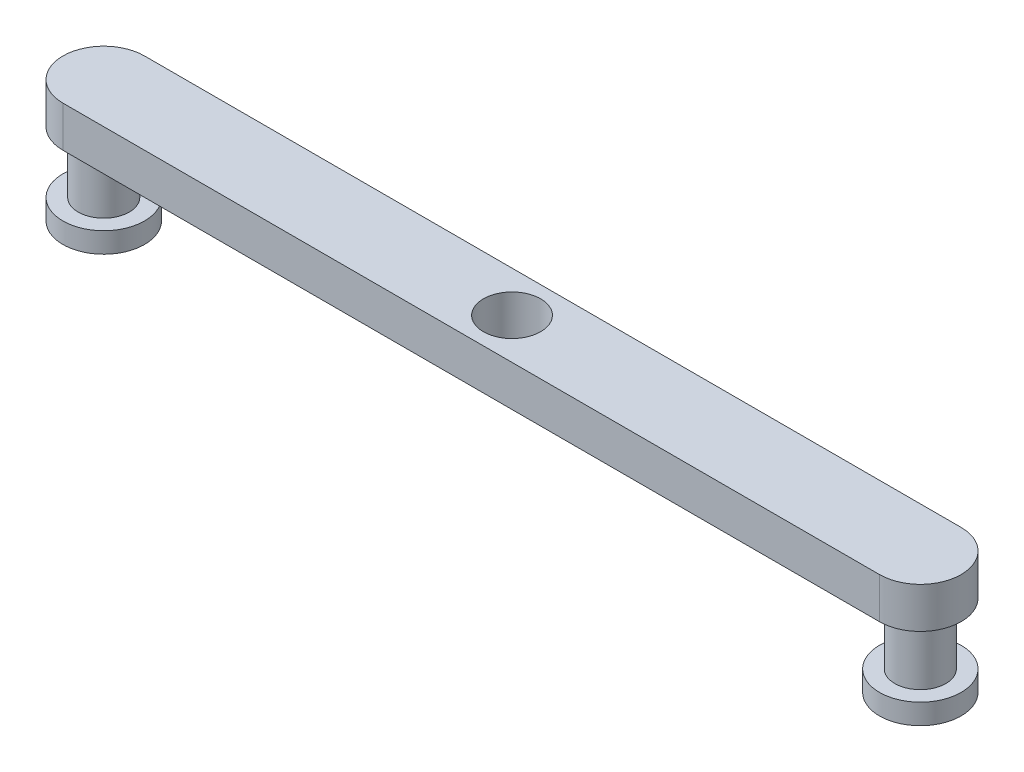
ISO-10303-21;
HEADER;
FILE_DESCRIPTION(('STEP AP214'),'2;1');
FILE_NAME('part.step','',(''),(''),'','','');
FILE_SCHEMA(('AUTOMOTIVE_DESIGN { 1 0 10303 214 1 1 1 1 }'));
ENDSEC;
DATA;
#1=APPLICATION_CONTEXT('core data for automotive mechanical design processes');
#2=APPLICATION_PROTOCOL_DEFINITION('international standard','automotive_design',2000,#1);
#3=PRODUCT_CONTEXT('',#1,'mechanical');
#4=PRODUCT('Part','Part','',(#3));
#5=PRODUCT_RELATED_PRODUCT_CATEGORY('part','',(#4));
#6=PRODUCT_DEFINITION_FORMATION('','',#4);
#7=PRODUCT_DEFINITION_CONTEXT('part definition',#1,'design');
#8=PRODUCT_DEFINITION('design','',#6,#7);
#9=PRODUCT_DEFINITION_SHAPE('','',#8);
#10=(LENGTH_UNIT() NAMED_UNIT(*) SI_UNIT(.MILLI.,.METRE.));
#11=(NAMED_UNIT(*) PLANE_ANGLE_UNIT() SI_UNIT($,.RADIAN.));
#12=(NAMED_UNIT(*) SI_UNIT($,.STERADIAN.) SOLID_ANGLE_UNIT());
#13=UNCERTAINTY_MEASURE_WITH_UNIT(LENGTH_MEASURE(1.E-05),#10,'distance_accuracy_value','');
#14=(GEOMETRIC_REPRESENTATION_CONTEXT(3) GLOBAL_UNCERTAINTY_ASSIGNED_CONTEXT((#13)) GLOBAL_UNIT_ASSIGNED_CONTEXT((#10,
#11,#12)) REPRESENTATION_CONTEXT('',''));
#15=CARTESIAN_POINT('',(0.,0.,0.));
#16=DIRECTION('',(0.,0.,1.));
#17=DIRECTION('',(1.,0.,0.));
#18=AXIS2_PLACEMENT_3D('',#15,#16,#17);
#19=CARTESIAN_POINT('',(-50.8,5.08,0.));
#20=DIRECTION('',(0.,-1.,0.));
#21=DIRECTION('',(0.,0.,-1.));
#22=AXIS2_PLACEMENT_3D('',#19,#20,#21);
#23=CYLINDRICAL_SURFACE('',#22,5.08);
#24=CARTESIAN_POINT('',(-50.8,0.,0.));
#25=DIRECTION('',(0.,1.,0.));
#26=DIRECTION('',(0.,0.,1.));
#27=AXIS2_PLACEMENT_3D('',#24,#25,#26);
#28=CIRCLE('',#27,5.08);
#29=CARTESIAN_POINT('',(-50.8,0.,-5.08));
#30=VERTEX_POINT('',#29);
#31=CARTESIAN_POINT('',(-50.8,0.,5.08));
#32=VERTEX_POINT('',#31);
#33=EDGE_CURVE('E102',#30,#32,#28,.T.);
#34=ORIENTED_EDGE('',*,*,#33,.T.);
#35=DIRECTION('',(0.,-1.,0.));
#36=VECTOR('',#35,1.);
#37=CARTESIAN_POINT('',(-50.8,5.08,5.08));
#38=LINE('',#37,#36);
#39=CARTESIAN_POINT('',(-50.8,5.08,5.08));
#40=VERTEX_POINT('',#39);
#41=EDGE_CURVE('E93',#40,#32,#38,.T.);
#42=ORIENTED_EDGE('',*,*,#41,.F.);
#43=CARTESIAN_POINT('',(-50.8,5.08,0.));
#44=DIRECTION('',(0.,1.,0.));
#45=DIRECTION('',(0.,0.,1.));
#46=AXIS2_PLACEMENT_3D('',#43,#44,#45);
#47=CIRCLE('',#46,5.08);
#48=CARTESIAN_POINT('',(-50.8,5.08,-5.08));
#49=VERTEX_POINT('',#48);
#50=EDGE_CURVE('E87',#49,#40,#47,.T.);
#51=ORIENTED_EDGE('',*,*,#50,.F.);
#52=DIRECTION('',(0.,-1.,0.));
#53=VECTOR('',#52,1.);
#54=CARTESIAN_POINT('',(-50.8,5.08,-5.08));
#55=LINE('',#54,#53);
#56=EDGE_CURVE('E98',#49,#30,#55,.T.);
#57=ORIENTED_EDGE('',*,*,#56,.T.);
#58=EDGE_LOOP('',(#34,#42,#51,#57));
#59=FACE_BOUND('',#58,.T.);
#60=ADVANCED_FACE('F35',(#59),#23,.T.);
#61=CARTESIAN_POINT('',(-50.8,5.08,5.08));
#62=DIRECTION('',(0.,0.,-1.));
#63=DIRECTION('',(-1.,0.,0.));
#64=AXIS2_PLACEMENT_3D('',#61,#62,#63);
#65=PLANE('',#64);
#66=DIRECTION('',(1.,0.,0.));
#67=VECTOR('',#66,1.);
#68=CARTESIAN_POINT('',(-50.8,0.,5.08));
#69=LINE('',#68,#67);
#70=CARTESIAN_POINT('',(50.8,0.,5.08));
#71=VERTEX_POINT('',#70);
#72=EDGE_CURVE('E92',#32,#71,#69,.T.);
#73=ORIENTED_EDGE('',*,*,#72,.T.);
#74=DIRECTION('',(0.,-1.,0.));
#75=VECTOR('',#74,1.);
#76=CARTESIAN_POINT('',(50.8,5.08,5.08));
#77=LINE('',#76,#75);
#78=CARTESIAN_POINT('',(50.8,5.08,5.08));
#79=VERTEX_POINT('',#78);
#80=EDGE_CURVE('E90',#79,#71,#77,.T.);
#81=ORIENTED_EDGE('',*,*,#80,.F.);
#82=DIRECTION('',(1.,0.,0.));
#83=VECTOR('',#82,1.);
#84=CARTESIAN_POINT('',(-50.8,5.08,5.08));
#85=LINE('',#84,#83);
#86=EDGE_CURVE('E82',#40,#79,#85,.T.);
#87=ORIENTED_EDGE('',*,*,#86,.F.);
#88=ORIENTED_EDGE('',*,*,#41,.T.);
#89=EDGE_LOOP('',(#73,#81,#87,#88));
#90=FACE_BOUND('',#89,.T.);
#91=ADVANCED_FACE('F91',(#90),#65,.F.);
#92=CARTESIAN_POINT('',(50.8,5.08,0.));
#93=DIRECTION('',(0.,-1.,0.));
#94=DIRECTION('',(0.,0.,-1.));
#95=AXIS2_PLACEMENT_3D('',#92,#93,#94);
#96=CYLINDRICAL_SURFACE('',#95,5.08);
#97=CARTESIAN_POINT('',(50.8,0.,0.));
#98=DIRECTION('',(0.,1.,0.));
#99=DIRECTION('',(0.,0.,1.));
#100=AXIS2_PLACEMENT_3D('',#97,#98,#99);
#101=CIRCLE('',#100,5.08);
#102=CARTESIAN_POINT('',(50.8,0.,-5.08));
#103=VERTEX_POINT('',#102);
#104=EDGE_CURVE('E68',#71,#103,#101,.T.);
#105=ORIENTED_EDGE('',*,*,#104,.T.);
#106=DIRECTION('',(0.,-1.,0.));
#107=VECTOR('',#106,1.);
#108=CARTESIAN_POINT('',(50.8,5.08,-5.08));
#109=LINE('',#108,#107);
#110=CARTESIAN_POINT('',(50.8,5.08,-5.08));
#111=VERTEX_POINT('',#110);
#112=EDGE_CURVE('E94',#111,#103,#109,.T.);
#113=ORIENTED_EDGE('',*,*,#112,.F.);
#114=CARTESIAN_POINT('',(50.8,5.08,0.));
#115=DIRECTION('',(0.,1.,0.));
#116=DIRECTION('',(0.,0.,1.));
#117=AXIS2_PLACEMENT_3D('',#114,#115,#116);
#118=CIRCLE('',#117,5.08);
#119=EDGE_CURVE('E85',#79,#111,#118,.T.);
#120=ORIENTED_EDGE('',*,*,#119,.F.);
#121=ORIENTED_EDGE('',*,*,#80,.T.);
#122=EDGE_LOOP('',(#105,#113,#120,#121));
#123=FACE_BOUND('',#122,.T.);
#124=ADVANCED_FACE('F96',(#123),#96,.T.);
#125=CARTESIAN_POINT('',(-50.8,5.08,-5.08));
#126=DIRECTION('',(0.,0.,1.));
#127=DIRECTION('',(1.,0.,0.));
#128=AXIS2_PLACEMENT_3D('',#125,#126,#127);
#129=PLANE('',#128);
#130=DIRECTION('',(-1.,0.,0.));
#131=VECTOR('',#130,1.);
#132=CARTESIAN_POINT('',(-50.8,0.,-5.08));
#133=LINE('',#132,#131);
#134=EDGE_CURVE('E74',#103,#30,#133,.T.);
#135=ORIENTED_EDGE('',*,*,#134,.T.);
#136=ORIENTED_EDGE('',*,*,#56,.F.);
#137=DIRECTION('',(-1.,0.,0.));
#138=VECTOR('',#137,1.);
#139=CARTESIAN_POINT('',(-50.8,5.08,-5.08));
#140=LINE('',#139,#138);
#141=EDGE_CURVE('E51',#111,#49,#140,.T.);
#142=ORIENTED_EDGE('',*,*,#141,.F.);
#143=ORIENTED_EDGE('',*,*,#112,.T.);
#144=EDGE_LOOP('',(#135,#136,#142,#143));
#145=FACE_BOUND('',#144,.T.);
#146=ADVANCED_FACE('F123',(#145),#129,.F.);
#147=CARTESIAN_POINT('',(-50.8,5.08,0.));
#148=DIRECTION('',(0.,1.,0.));
#149=DIRECTION('',(0.,0.,1.));
#150=AXIS2_PLACEMENT_3D('',#147,#148,#149);
#151=PLANE('',#150);
#152=CARTESIAN_POINT('',(0.,5.08,0.));
#153=DIRECTION('',(0.,1.,0.));
#154=DIRECTION('',(0.,0.,1.));
#155=AXIS2_PLACEMENT_3D('',#152,#153,#154);
#156=CIRCLE('',#155,3.556);
#157=CARTESIAN_POINT('',(0.,5.08,3.556));
#158=VERTEX_POINT('',#157);
#159=EDGE_CURVE('E255',#158,#158,#156,.T.);
#160=ORIENTED_EDGE('',*,*,#159,.F.);
#161=EDGE_LOOP('',(#160));
#162=FACE_BOUND('',#161,.T.);
#163=ORIENTED_EDGE('',*,*,#50,.T.);
#164=ORIENTED_EDGE('',*,*,#86,.T.);
#165=ORIENTED_EDGE('',*,*,#119,.T.);
#166=ORIENTED_EDGE('',*,*,#141,.T.);
#167=EDGE_LOOP('',(#163,#164,#165,#166));
#168=FACE_BOUND('',#167,.T.);
#169=ADVANCED_FACE('F83',(#162,#168),#151,.T.);
#170=CARTESIAN_POINT('',(-50.8,0.,0.));
#171=DIRECTION('',(0.,1.,0.));
#172=DIRECTION('',(0.,0.,1.));
#173=AXIS2_PLACEMENT_3D('',#170,#171,#172);
#174=PLANE('',#173);
#175=CARTESIAN_POINT('',(0.,0.,0.));
#176=DIRECTION('',(0.,1.,0.));
#177=DIRECTION('',(0.,0.,1.));
#178=AXIS2_PLACEMENT_3D('',#175,#176,#177);
#179=CIRCLE('',#178,3.556);
#180=CARTESIAN_POINT('',(0.,0.,3.556));
#181=VERTEX_POINT('',#180);
#182=EDGE_CURVE('E258',#181,#181,#179,.T.);
#183=ORIENTED_EDGE('',*,*,#182,.T.);
#184=EDGE_LOOP('',(#183));
#185=FACE_BOUND('',#184,.T.);
#186=CARTESIAN_POINT('',(50.8,0.,0.));
#187=DIRECTION('',(0.,1.,0.));
#188=DIRECTION('',(0.,0.,1.));
#189=AXIS2_PLACEMENT_3D('',#186,#187,#188);
#190=CIRCLE('',#189,3.175);
#191=CARTESIAN_POINT('',(50.8,0.,3.175));
#192=VERTEX_POINT('',#191);
#193=EDGE_CURVE('E11',#192,#192,#190,.F.);
#194=ORIENTED_EDGE('',*,*,#193,.F.);
#195=EDGE_LOOP('',(#194));
#196=FACE_BOUND('',#195,.T.);
#197=CARTESIAN_POINT('',(-50.8,0.,0.));
#198=DIRECTION('',(0.,1.,0.));
#199=DIRECTION('',(0.,0.,1.));
#200=AXIS2_PLACEMENT_3D('',#197,#198,#199);
#201=CIRCLE('',#200,3.175);
#202=CARTESIAN_POINT('',(-50.8,0.,3.175));
#203=VERTEX_POINT('',#202);
#204=EDGE_CURVE('E43',#203,#203,#201,.F.);
#205=ORIENTED_EDGE('',*,*,#204,.F.);
#206=EDGE_LOOP('',(#205));
#207=FACE_BOUND('',#206,.T.);
#208=ORIENTED_EDGE('',*,*,#33,.F.);
#209=ORIENTED_EDGE('',*,*,#134,.F.);
#210=ORIENTED_EDGE('',*,*,#104,.F.);
#211=ORIENTED_EDGE('',*,*,#72,.F.);
#212=EDGE_LOOP('',(#208,#209,#210,#211));
#213=FACE_BOUND('',#212,.T.);
#214=ADVANCED_FACE('F116',(#185,#196,#207,#213),#174,.F.);
#215=CARTESIAN_POINT('',(-50.8,-7.62,0.));
#216=DIRECTION('',(0.,1.,0.));
#217=DIRECTION('',(0.,0.,1.));
#218=AXIS2_PLACEMENT_3D('',#215,#216,#217);
#219=CYLINDRICAL_SURFACE('',#218,3.175);
#220=CARTESIAN_POINT('',(-50.8,-7.62,0.));
#221=DIRECTION('',(0.,-1.,0.));
#222=DIRECTION('',(0.,0.,-1.));
#223=AXIS2_PLACEMENT_3D('',#220,#221,#222);
#224=CIRCLE('',#223,3.175);
#225=CARTESIAN_POINT('',(-50.8,-7.62,3.175));
#226=VERTEX_POINT('',#225);
#227=EDGE_CURVE('E105',#226,#226,#224,.T.);
#228=CARTESIAN_POINT('',(-50.8,-7.62,3.175));
#229=CARTESIAN_POINT('',(-50.8,-7.540625,3.175));
#230=CARTESIAN_POINT('',(-50.8,-7.46125,3.175));
#231=CARTESIAN_POINT('',(-50.8,-7.3025,3.175));
#232=CARTESIAN_POINT('',(-50.8,-7.223125,3.175));
#233=CARTESIAN_POINT('',(-50.8,-7.064375,3.175));
#234=CARTESIAN_POINT('',(-50.8,-6.985,3.175));
#235=CARTESIAN_POINT('',(-50.8,-6.82625,3.175));
#236=CARTESIAN_POINT('',(-50.8,-6.746875,3.175));
#237=CARTESIAN_POINT('',(-50.8,-6.588125,3.175));
#238=CARTESIAN_POINT('',(-50.8,-6.50875,3.175));
#239=CARTESIAN_POINT('',(-50.8,-6.35,3.175));
#240=CARTESIAN_POINT('',(-50.8,-6.270625,3.175));
#241=CARTESIAN_POINT('',(-50.8,-6.111875,3.175));
#242=CARTESIAN_POINT('',(-50.8,-6.0325,3.175));
#243=CARTESIAN_POINT('',(-50.8,-5.87375,3.175));
#244=CARTESIAN_POINT('',(-50.8,-5.794375,3.175));
#245=CARTESIAN_POINT('',(-50.8,-5.635625,3.175));
#246=CARTESIAN_POINT('',(-50.8,-5.55625,3.175));
#247=CARTESIAN_POINT('',(-50.8,-5.3975,3.175));
#248=CARTESIAN_POINT('',(-50.8,-5.318125,3.175));
#249=CARTESIAN_POINT('',(-50.8,-5.159375,3.175));
#250=CARTESIAN_POINT('',(-50.8,-5.08,3.175));
#251=CARTESIAN_POINT('',(-50.8,-4.92125,3.175));
#252=CARTESIAN_POINT('',(-50.8,-4.841875,3.175));
#253=CARTESIAN_POINT('',(-50.8,-4.683125,3.175));
#254=CARTESIAN_POINT('',(-50.8,-4.60375,3.175));
#255=CARTESIAN_POINT('',(-50.8,-4.445,3.175));
#256=CARTESIAN_POINT('',(-50.8,-4.365625,3.175));
#257=CARTESIAN_POINT('',(-50.8,-4.206875,3.175));
#258=CARTESIAN_POINT('',(-50.8,-4.1275,3.175));
#259=CARTESIAN_POINT('',(-50.8,-3.96875,3.175));
#260=CARTESIAN_POINT('',(-50.8,-3.889375,3.175));
#261=CARTESIAN_POINT('',(-50.8,-3.730625,3.175));
#262=CARTESIAN_POINT('',(-50.8,-3.65125,3.175));
#263=CARTESIAN_POINT('',(-50.8,-3.4925,3.175));
#264=CARTESIAN_POINT('',(-50.8,-3.413125,3.175));
#265=CARTESIAN_POINT('',(-50.8,-3.254375,3.175));
#266=CARTESIAN_POINT('',(-50.8,-3.175,3.175));
#267=CARTESIAN_POINT('',(-50.8,-3.01625,3.175));
#268=CARTESIAN_POINT('',(-50.8,-2.936875,3.175));
#269=CARTESIAN_POINT('',(-50.8,-2.778125,3.175));
#270=CARTESIAN_POINT('',(-50.8,-2.69875,3.175));
#271=CARTESIAN_POINT('',(-50.8,-2.54,3.175));
#272=CARTESIAN_POINT('',(-50.8,-2.460625,3.175));
#273=CARTESIAN_POINT('',(-50.8,-2.301875,3.175));
#274=CARTESIAN_POINT('',(-50.8,-2.2225,3.175));
#275=CARTESIAN_POINT('',(-50.8,-2.06375,3.175));
#276=CARTESIAN_POINT('',(-50.8,-1.984375,3.175));
#277=CARTESIAN_POINT('',(-50.8,-1.825625,3.175));
#278=CARTESIAN_POINT('',(-50.8,-1.74625,3.175));
#279=CARTESIAN_POINT('',(-50.8,-1.5875,3.175));
#280=CARTESIAN_POINT('',(-50.8,-1.508125,3.175));
#281=CARTESIAN_POINT('',(-50.8,-1.349375,3.175));
#282=CARTESIAN_POINT('',(-50.8,-1.27,3.175));
#283=CARTESIAN_POINT('',(-50.8,-1.11125,3.175));
#284=CARTESIAN_POINT('',(-50.8,-1.031875,3.175));
#285=CARTESIAN_POINT('',(-50.8,-0.873125,3.175));
#286=CARTESIAN_POINT('',(-50.8,-0.79375,3.175));
#287=CARTESIAN_POINT('',(-50.8,-0.635,3.175));
#288=CARTESIAN_POINT('',(-50.8,-0.555625,3.175));
#289=CARTESIAN_POINT('',(-50.8,-0.396875,3.175));
#290=CARTESIAN_POINT('',(-50.8,-0.3175,3.175));
#291=CARTESIAN_POINT('',(-50.8,-0.15875,3.175));
#292=CARTESIAN_POINT('',(-50.8,-0.0793749999999999,3.175));
#293=CARTESIAN_POINT('',(-50.8,0.,3.175));
#294=B_SPLINE_CURVE_WITH_KNOTS('',3,(#228,#229,#230,#231,#232,#233,#234,#235,#236,#237,#238,
#239,#240,#241,#242,#243,#244,#245,#246,#247,#248,#249,#250,#251,#252,#253,#254,#255,#256,#257,
#258,#259,#260,#261,#262,#263,#264,#265,#266,#267,#268,#269,#270,#271,#272,#273,#274,#275,#276,
#277,#278,#279,#280,#281,#282,#283,#284,#285,#286,#287,#288,#289,#290,#291,#292,#293),
.UNSPECIFIED.,.F.,.F.,(4,2,2,2,2,2,2,2,2,2,2,2,2,2,2,2,2,2,2,2,2,2,2,2,2,2,2,2,2,2,2,2,4),(0.,
0.238125,0.47625,0.714375000000001,0.9525,1.190625,1.42875,1.666875,1.905,2.143125,2.38125,
2.619375,2.8575,3.095625,3.33375,3.571875,3.81,4.048125,4.28625,4.524375,4.7625,5.000625,
5.23875,5.476875,5.715,5.953125,6.19125,6.429375,6.6675,6.905625,7.14375,7.381875,7.62),.UNSPECIFIED.);
#295=EDGE_CURVE('BSEAM114',#226,#203,#294,.T.);
#296=ORIENTED_EDGE('',*,*,#227,.F.);
#297=ORIENTED_EDGE('',*,*,#204,.T.);
#298=ORIENTED_EDGE('',*,*,#295,.T.);
#299=ORIENTED_EDGE('',*,*,#295,.F.);
#300=EDGE_LOOP('',(#296,#298,#297,#299));
#301=FACE_BOUND('',#300,.T.);
#302=ADVANCED_FACE('F114',(#301),#219,.T.);
#303=CARTESIAN_POINT('',(50.8,-7.62,0.));
#304=DIRECTION('',(0.,1.,0.));
#305=DIRECTION('',(0.,0.,1.));
#306=AXIS2_PLACEMENT_3D('',#303,#304,#305);
#307=CYLINDRICAL_SURFACE('',#306,3.175);
#308=CARTESIAN_POINT('',(50.8,-7.62,0.));
#309=DIRECTION('',(0.,-1.,0.));
#310=DIRECTION('',(0.,0.,-1.));
#311=AXIS2_PLACEMENT_3D('',#308,#309,#310);
#312=CIRCLE('',#311,3.175);
#313=CARTESIAN_POINT('',(50.8,-7.62,3.175));
#314=VERTEX_POINT('',#313);
#315=EDGE_CURVE('E272',#314,#314,#312,.T.);
#316=CARTESIAN_POINT('',(50.8,-7.62,3.175));
#317=CARTESIAN_POINT('',(50.8,-7.540625,3.175));
#318=CARTESIAN_POINT('',(50.8,-7.46125,3.175));
#319=CARTESIAN_POINT('',(50.8,-7.3025,3.175));
#320=CARTESIAN_POINT('',(50.8,-7.223125,3.175));
#321=CARTESIAN_POINT('',(50.8,-7.064375,3.175));
#322=CARTESIAN_POINT('',(50.8,-6.985,3.175));
#323=CARTESIAN_POINT('',(50.8,-6.82625,3.175));
#324=CARTESIAN_POINT('',(50.8,-6.746875,3.175));
#325=CARTESIAN_POINT('',(50.8,-6.588125,3.175));
#326=CARTESIAN_POINT('',(50.8,-6.50875,3.175));
#327=CARTESIAN_POINT('',(50.8,-6.35,3.175));
#328=CARTESIAN_POINT('',(50.8,-6.270625,3.175));
#329=CARTESIAN_POINT('',(50.8,-6.111875,3.175));
#330=CARTESIAN_POINT('',(50.8,-6.0325,3.175));
#331=CARTESIAN_POINT('',(50.8,-5.87375,3.175));
#332=CARTESIAN_POINT('',(50.8,-5.794375,3.175));
#333=CARTESIAN_POINT('',(50.8,-5.635625,3.175));
#334=CARTESIAN_POINT('',(50.8,-5.55625,3.175));
#335=CARTESIAN_POINT('',(50.8,-5.3975,3.175));
#336=CARTESIAN_POINT('',(50.8,-5.318125,3.175));
#337=CARTESIAN_POINT('',(50.8,-5.159375,3.175));
#338=CARTESIAN_POINT('',(50.8,-5.08,3.175));
#339=CARTESIAN_POINT('',(50.8,-4.92125,3.175));
#340=CARTESIAN_POINT('',(50.8,-4.841875,3.175));
#341=CARTESIAN_POINT('',(50.8,-4.683125,3.175));
#342=CARTESIAN_POINT('',(50.8,-4.60375,3.175));
#343=CARTESIAN_POINT('',(50.8,-4.445,3.175));
#344=CARTESIAN_POINT('',(50.8,-4.365625,3.175));
#345=CARTESIAN_POINT('',(50.8,-4.206875,3.175));
#346=CARTESIAN_POINT('',(50.8,-4.1275,3.175));
#347=CARTESIAN_POINT('',(50.8,-3.96875,3.175));
#348=CARTESIAN_POINT('',(50.8,-3.889375,3.175));
#349=CARTESIAN_POINT('',(50.8,-3.730625,3.175));
#350=CARTESIAN_POINT('',(50.8,-3.65125,3.175));
#351=CARTESIAN_POINT('',(50.8,-3.4925,3.175));
#352=CARTESIAN_POINT('',(50.8,-3.413125,3.175));
#353=CARTESIAN_POINT('',(50.8,-3.254375,3.175));
#354=CARTESIAN_POINT('',(50.8,-3.175,3.175));
#355=CARTESIAN_POINT('',(50.8,-3.01625,3.175));
#356=CARTESIAN_POINT('',(50.8,-2.936875,3.175));
#357=CARTESIAN_POINT('',(50.8,-2.778125,3.175));
#358=CARTESIAN_POINT('',(50.8,-2.69875,3.175));
#359=CARTESIAN_POINT('',(50.8,-2.54,3.175));
#360=CARTESIAN_POINT('',(50.8,-2.460625,3.175));
#361=CARTESIAN_POINT('',(50.8,-2.301875,3.175));
#362=CARTESIAN_POINT('',(50.8,-2.2225,3.175));
#363=CARTESIAN_POINT('',(50.8,-2.06375,3.175));
#364=CARTESIAN_POINT('',(50.8,-1.984375,3.175));
#365=CARTESIAN_POINT('',(50.8,-1.825625,3.175));
#366=CARTESIAN_POINT('',(50.8,-1.74625,3.175));
#367=CARTESIAN_POINT('',(50.8,-1.5875,3.175));
#368=CARTESIAN_POINT('',(50.8,-1.508125,3.175));
#369=CARTESIAN_POINT('',(50.8,-1.349375,3.175));
#370=CARTESIAN_POINT('',(50.8,-1.27,3.175));
#371=CARTESIAN_POINT('',(50.8,-1.11125,3.175));
#372=CARTESIAN_POINT('',(50.8,-1.031875,3.175));
#373=CARTESIAN_POINT('',(50.8,-0.873125,3.175));
#374=CARTESIAN_POINT('',(50.8,-0.79375,3.175));
#375=CARTESIAN_POINT('',(50.8,-0.635,3.175));
#376=CARTESIAN_POINT('',(50.8,-0.555625,3.175));
#377=CARTESIAN_POINT('',(50.8,-0.396875,3.175));
#378=CARTESIAN_POINT('',(50.8,-0.3175,3.175));
#379=CARTESIAN_POINT('',(50.8,-0.15875,3.175));
#380=CARTESIAN_POINT('',(50.8,-0.0793749999999999,3.175));
#381=CARTESIAN_POINT('',(50.8,0.,3.175));
#382=B_SPLINE_CURVE_WITH_KNOTS('',3,(#316,#317,#318,#319,#320,#321,#322,#323,#324,#325,#326,
#327,#328,#329,#330,#331,#332,#333,#334,#335,#336,#337,#338,#339,#340,#341,#342,#343,#344,#345,
#346,#347,#348,#349,#350,#351,#352,#353,#354,#355,#356,#357,#358,#359,#360,#361,#362,#363,#364,
#365,#366,#367,#368,#369,#370,#371,#372,#373,#374,#375,#376,#377,#378,#379,#380,#381),
.UNSPECIFIED.,.F.,.F.,(4,2,2,2,2,2,2,2,2,2,2,2,2,2,2,2,2,2,2,2,2,2,2,2,2,2,2,2,2,2,2,2,4),(0.,
0.238125,0.47625,0.714375000000001,0.9525,1.190625,1.42875,1.666875,1.905,2.143125,2.38125,
2.619375,2.8575,3.095625,3.33375,3.571875,3.81,4.048125,4.28625,4.524375,4.7625,5.000625,
5.23875,5.476875,5.715,5.953125,6.19125,6.429375,6.6675,6.905625,7.14375,7.381875,7.62),.UNSPECIFIED.);
#383=EDGE_CURVE('BSEAM157',#314,#192,#382,.T.);
#384=ORIENTED_EDGE('',*,*,#315,.F.);
#385=ORIENTED_EDGE('',*,*,#193,.T.);
#386=ORIENTED_EDGE('',*,*,#383,.T.);
#387=ORIENTED_EDGE('',*,*,#383,.F.);
#388=EDGE_LOOP('',(#384,#386,#385,#387));
#389=FACE_BOUND('',#388,.T.);
#390=ADVANCED_FACE('F157',(#389),#307,.T.);
#391=CARTESIAN_POINT('',(-50.8,-10.16,0.));
#392=DIRECTION('',(0.,1.,0.));
#393=DIRECTION('',(0.,0.,1.));
#394=AXIS2_PLACEMENT_3D('',#391,#392,#393);
#395=CYLINDRICAL_SURFACE('',#394,5.08);
#396=CARTESIAN_POINT('',(-50.8,-10.16,0.));
#397=DIRECTION('',(0.,-1.,0.));
#398=DIRECTION('',(0.,0.,-1.));
#399=AXIS2_PLACEMENT_3D('',#396,#397,#398);
#400=CIRCLE('',#399,5.08);
#401=CARTESIAN_POINT('',(-50.8,-10.16,-5.08));
#402=VERTEX_POINT('',#401);
#403=EDGE_CURVE('E269',#402,#402,#400,.T.);
#404=ORIENTED_EDGE('',*,*,#403,.F.);
#405=EDGE_LOOP('',(#404));
#406=FACE_BOUND('',#405,.T.);
#407=CARTESIAN_POINT('',(-50.8,-7.62,0.));
#408=DIRECTION('',(0.,-1.,0.));
#409=DIRECTION('',(0.,0.,-1.));
#410=AXIS2_PLACEMENT_3D('',#407,#408,#409);
#411=CIRCLE('',#410,5.08);
#412=CARTESIAN_POINT('',(-50.8,-7.62,-5.08));
#413=VERTEX_POINT('',#412);
#414=EDGE_CURVE('E266',#413,#413,#411,.T.);
#415=ORIENTED_EDGE('',*,*,#414,.T.);
#416=EDGE_LOOP('',(#415));
#417=FACE_BOUND('',#416,.T.);
#418=ADVANCED_FACE('F168',(#406,#417),#395,.T.);
#419=CARTESIAN_POINT('',(-50.8,-10.16,0.));
#420=DIRECTION('',(0.,-1.,0.));
#421=DIRECTION('',(0.,0.,-1.));
#422=AXIS2_PLACEMENT_3D('',#419,#420,#421);
#423=PLANE('',#422);
#424=ORIENTED_EDGE('',*,*,#403,.T.);
#425=EDGE_LOOP('',(#424));
#426=FACE_BOUND('',#425,.T.);
#427=ADVANCED_FACE('F178',(#426),#423,.T.);
#428=CARTESIAN_POINT('',(-50.8,-7.62,0.));
#429=DIRECTION('',(0.,-1.,0.));
#430=DIRECTION('',(0.,0.,-1.));
#431=AXIS2_PLACEMENT_3D('',#428,#429,#430);
#432=PLANE('',#431);
#433=ORIENTED_EDGE('',*,*,#227,.T.);
#434=EDGE_LOOP('',(#433));
#435=FACE_BOUND('',#434,.T.);
#436=ORIENTED_EDGE('',*,*,#414,.F.);
#437=EDGE_LOOP('',(#436));
#438=FACE_BOUND('',#437,.T.);
#439=ADVANCED_FACE('F188',(#435,#438),#432,.F.);
#440=CARTESIAN_POINT('',(50.8,-10.16,0.));
#441=DIRECTION('',(0.,1.,0.));
#442=DIRECTION('',(0.,0.,1.));
#443=AXIS2_PLACEMENT_3D('',#440,#441,#442);
#444=CYLINDRICAL_SURFACE('',#443,5.08);
#445=CARTESIAN_POINT('',(50.8,-10.16,0.));
#446=DIRECTION('',(0.,-1.,0.));
#447=DIRECTION('',(0.,0.,-1.));
#448=AXIS2_PLACEMENT_3D('',#445,#446,#447);
#449=CIRCLE('',#448,5.08);
#450=CARTESIAN_POINT('',(50.8,-10.16,-5.08));
#451=VERTEX_POINT('',#450);
#452=EDGE_CURVE('E263',#451,#451,#449,.T.);
#453=ORIENTED_EDGE('',*,*,#452,.F.);
#454=EDGE_LOOP('',(#453));
#455=FACE_BOUND('',#454,.T.);
#456=CARTESIAN_POINT('',(50.8,-7.62,0.));
#457=DIRECTION('',(0.,-1.,0.));
#458=DIRECTION('',(0.,0.,-1.));
#459=AXIS2_PLACEMENT_3D('',#456,#457,#458);
#460=CIRCLE('',#459,5.08);
#461=CARTESIAN_POINT('',(50.8,-7.62,-5.08));
#462=VERTEX_POINT('',#461);
#463=EDGE_CURVE('E260',#462,#462,#460,.T.);
#464=ORIENTED_EDGE('',*,*,#463,.T.);
#465=EDGE_LOOP('',(#464));
#466=FACE_BOUND('',#465,.T.);
#467=ADVANCED_FACE('F198',(#455,#466),#444,.T.);
#468=CARTESIAN_POINT('',(50.8,-10.16,0.));
#469=DIRECTION('',(0.,-1.,0.));
#470=DIRECTION('',(0.,0.,-1.));
#471=AXIS2_PLACEMENT_3D('',#468,#469,#470);
#472=PLANE('',#471);
#473=ORIENTED_EDGE('',*,*,#452,.T.);
#474=EDGE_LOOP('',(#473));
#475=FACE_BOUND('',#474,.T.);
#476=ADVANCED_FACE('F208',(#475),#472,.T.);
#477=CARTESIAN_POINT('',(50.8,-7.62,0.));
#478=DIRECTION('',(0.,-1.,0.));
#479=DIRECTION('',(0.,0.,-1.));
#480=AXIS2_PLACEMENT_3D('',#477,#478,#479);
#481=PLANE('',#480);
#482=ORIENTED_EDGE('',*,*,#315,.T.);
#483=EDGE_LOOP('',(#482));
#484=FACE_BOUND('',#483,.T.);
#485=ORIENTED_EDGE('',*,*,#463,.F.);
#486=EDGE_LOOP('',(#485));
#487=FACE_BOUND('',#486,.T.);
#488=ADVANCED_FACE('F218',(#484,#487),#481,.F.);
#489=CARTESIAN_POINT('',(0.,5.08,0.));
#490=DIRECTION('',(0.,-1.,0.));
#491=DIRECTION('',(0.,0.,-1.));
#492=AXIS2_PLACEMENT_3D('',#489,#490,#491);
#493=CYLINDRICAL_SURFACE('',#492,3.556);
#494=ORIENTED_EDGE('',*,*,#159,.T.);
#495=EDGE_LOOP('',(#494));
#496=FACE_BOUND('',#495,.T.);
#497=ORIENTED_EDGE('',*,*,#182,.F.);
#498=EDGE_LOOP('',(#497));
#499=FACE_BOUND('',#498,.T.);
#500=ADVANCED_FACE('F228',(#496,#499),#493,.F.);
#501=CLOSED_SHELL('',(#60,#91,#124,#146,#169,#214,#302,#390,#418,#427,#439,#467,#476,#488,#500));
#502=MANIFOLD_SOLID_BREP('B2',#501);
#503=ADVANCED_BREP_SHAPE_REPRESENTATION('',(#18,#502),#14);
#504=SHAPE_DEFINITION_REPRESENTATION(#9,#503);
ENDSEC;
END-ISO-10303-21;
